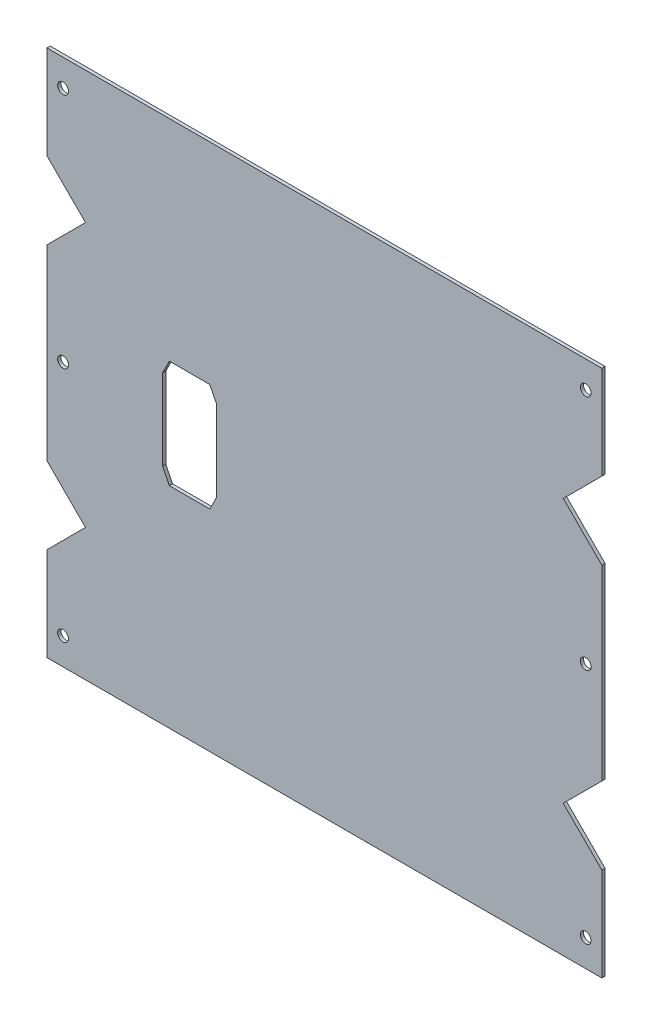
ISO-10303-21;
HEADER;
FILE_DESCRIPTION(('STEP AP214'),'2;1');
FILE_NAME('part.step','',(''),(''),'','','');
FILE_SCHEMA(('AUTOMOTIVE_DESIGN { 1 0 10303 214 1 1 1 1 }'));
ENDSEC;
DATA;
#1=APPLICATION_CONTEXT('core data for automotive mechanical design processes');
#2=APPLICATION_PROTOCOL_DEFINITION('international standard','automotive_design',2000,#1);
#3=PRODUCT_CONTEXT('',#1,'mechanical');
#4=PRODUCT('Part','Part','',(#3));
#5=PRODUCT_RELATED_PRODUCT_CATEGORY('part','',(#4));
#6=PRODUCT_DEFINITION_FORMATION('','',#4);
#7=PRODUCT_DEFINITION_CONTEXT('part definition',#1,'design');
#8=PRODUCT_DEFINITION('design','',#6,#7);
#9=PRODUCT_DEFINITION_SHAPE('','',#8);
#10=(LENGTH_UNIT() NAMED_UNIT(*) SI_UNIT(.MILLI.,.METRE.));
#11=(NAMED_UNIT(*) PLANE_ANGLE_UNIT() SI_UNIT($,.RADIAN.));
#12=(NAMED_UNIT(*) SI_UNIT($,.STERADIAN.) SOLID_ANGLE_UNIT());
#13=UNCERTAINTY_MEASURE_WITH_UNIT(LENGTH_MEASURE(1.E-05),#10,'distance_accuracy_value','');
#14=(GEOMETRIC_REPRESENTATION_CONTEXT(3) GLOBAL_UNCERTAINTY_ASSIGNED_CONTEXT((#13)) GLOBAL_UNIT_ASSIGNED_CONTEXT((#10,
#11,#12)) REPRESENTATION_CONTEXT('',''));
#15=CARTESIAN_POINT('',(0.,0.,0.));
#16=DIRECTION('',(0.,0.,1.));
#17=DIRECTION('',(1.,0.,0.));
#18=AXIS2_PLACEMENT_3D('',#15,#16,#17);
#19=CARTESIAN_POINT('',(0.,0.,-1.2));
#20=DIRECTION('',(0.,0.,1.));
#21=DIRECTION('',(1.,0.,0.));
#22=AXIS2_PLACEMENT_3D('',#19,#20,#21);
#23=PLANE('',#22);
#24=DIRECTION('',(0.707106781186546,0.707106781186549,0.));
#25=VECTOR('',#24,1.);
#26=CARTESIAN_POINT('',(-112.74800186836,24.8232233047034,-1.19999999999987));
#27=LINE('',#26,#25);
#28=CARTESIAN_POINT('',(-102.924778563656,34.6464466094067,-1.19999999999992));
#29=VERTEX_POINT('',#28);
#30=CARTESIAN_POINT('',(-88.6088358912349,48.9623892818282,-1.20000000000002));
#31=VERTEX_POINT('',#30);
#32=EDGE_CURVE('E860',#29,#31,#27,.T.);
#33=ORIENTED_EDGE('',*,*,#32,.T.);
#34=DIRECTION('',(-0.707106781186546,0.707106781186549,0.));
#35=VECTOR('',#34,1.);
#36=CARTESIAN_POINT('',(-112.748001868359,73.1015552589528,-1.19999999999967));
#37=LINE('',#36,#35);
#38=CARTESIAN_POINT('',(-102.924778563656,63.2783319542498,-1.19999999999982));
#39=VERTEX_POINT('',#38);
#40=EDGE_CURVE('E750',#31,#39,#37,.T.);
#41=ORIENTED_EDGE('',*,*,#40,.T.);
#42=DIRECTION('',(0.,1.,0.));
#43=VECTOR('',#42,1.);
#44=CARTESIAN_POINT('',(-102.924778563656,50.1247785636565,-1.19999999999991));
#45=LINE('',#44,#43);
#46=CARTESIAN_POINT('',(-102.924778563656,97.9247785636565,-1.19999999999958));
#47=VERTEX_POINT('',#46);
#48=EDGE_CURVE('E761',#47,#39,#45,.F.);
#49=ORIENTED_EDGE('',*,*,#48,.F.);
#50=DIRECTION('',(1.,0.,0.));
#51=VECTOR('',#50,1.);
#52=CARTESIAN_POINT('',(89.1247785636564,97.9247785636565,-1.19999999999968));
#53=LINE('',#52,#51);
#54=CARTESIAN_POINT('',(102.924778563656,97.9247785636565,-1.1999999999996));
#55=VERTEX_POINT('',#54);
#56=EDGE_CURVE('E779',#55,#47,#53,.F.);
#57=ORIENTED_EDGE('',*,*,#56,.F.);
#58=DIRECTION('',(0.,-1.,0.));
#59=VECTOR('',#58,1.);
#60=CARTESIAN_POINT('',(102.924778563656,97.9247785636565,-1.1999999999996));
#61=LINE('',#60,#59);
#62=CARTESIAN_POINT('',(102.924778563656,63.2783319542498,-1.19999999999984));
#63=VERTEX_POINT('',#62);
#64=EDGE_CURVE('E774',#63,#55,#61,.F.);
#65=ORIENTED_EDGE('',*,*,#64,.F.);
#66=DIRECTION('',(-0.707106781186546,-0.707106781186549,0.));
#67=VECTOR('',#66,1.);
#68=CARTESIAN_POINT('',(112.748001868359,73.1015552589529,-1.19999999999969));
#69=LINE('',#68,#67);
#70=CARTESIAN_POINT('',(88.6088358912349,48.9623892818282,-1.20000000000003));
#71=VERTEX_POINT('',#70);
#72=EDGE_CURVE('E753',#63,#71,#69,.T.);
#73=ORIENTED_EDGE('',*,*,#72,.T.);
#74=DIRECTION('',(0.707106781186546,-0.707106781186549,0.));
#75=VECTOR('',#74,1.);
#76=CARTESIAN_POINT('',(112.74800186836,24.8232233047034,-1.19999999999985));
#77=LINE('',#76,#75);
#78=CARTESIAN_POINT('',(102.924778563656,34.6464466094067,-1.19999999999991));
#79=VERTEX_POINT('',#78);
#80=EDGE_CURVE('E837',#71,#79,#77,.T.);
#81=ORIENTED_EDGE('',*,*,#80,.T.);
#82=DIRECTION('',(0.,-1.,0.));
#83=VECTOR('',#82,1.);
#84=CARTESIAN_POINT('',(102.924778563656,47.8,-1.19999999999991));
#85=LINE('',#84,#83);
#86=CARTESIAN_POINT('',(102.924778563656,-34.6464466094067,-1.19999999999991));
#87=VERTEX_POINT('',#86);
#88=EDGE_CURVE('E786',#87,#79,#85,.F.);
#89=ORIENTED_EDGE('',*,*,#88,.F.);
#90=DIRECTION('',(-0.707106781186546,-0.707106781186549,0.));
#91=VECTOR('',#90,1.);
#92=CARTESIAN_POINT('',(112.74800186836,-24.8232233047034,-1.19999999999985));
#93=LINE('',#92,#91);
#94=CARTESIAN_POINT('',(88.6088358912349,-48.9623892818283,-1.2));
#95=VERTEX_POINT('',#94);
#96=EDGE_CURVE('E835',#87,#95,#93,.T.);
#97=ORIENTED_EDGE('',*,*,#96,.T.);
#98=DIRECTION('',(0.707106781186546,-0.707106781186549,0.));
#99=VECTOR('',#98,1.);
#100=CARTESIAN_POINT('',(112.748001868359,-73.1015552589529,-1.19999999999966));
#101=LINE('',#100,#99);
#102=CARTESIAN_POINT('',(102.924778563656,-63.2783319542498,-1.19999999999981));
#103=VERTEX_POINT('',#102);
#104=EDGE_CURVE('E727',#95,#103,#101,.T.);
#105=ORIENTED_EDGE('',*,*,#104,.T.);
#106=DIRECTION('',(0.,-1.,0.));
#107=VECTOR('',#106,1.);
#108=CARTESIAN_POINT('',(102.924778563656,-50.1247785636565,-1.1999999999999));
#109=LINE('',#108,#107);
#110=CARTESIAN_POINT('',(102.924778563656,-97.9247785636565,-1.19999999999956));
#111=VERTEX_POINT('',#110);
#112=EDGE_CURVE('E799',#111,#103,#109,.F.);
#113=ORIENTED_EDGE('',*,*,#112,.F.);
#114=DIRECTION('',(-1.,0.,0.));
#115=VECTOR('',#114,1.);
#116=CARTESIAN_POINT('',(102.924778563656,-97.9247785636565,-1.19999999999956));
#117=LINE('',#116,#115);
#118=CARTESIAN_POINT('',(-102.924778563656,-97.9247785636565,-1.19999999999958));
#119=VERTEX_POINT('',#118);
#120=EDGE_CURVE('E818',#119,#111,#117,.F.);
#121=ORIENTED_EDGE('',*,*,#120,.F.);
#122=DIRECTION('',(0.,1.,0.));
#123=VECTOR('',#122,1.);
#124=CARTESIAN_POINT('',(-102.924778563656,-97.9247785636565,-1.19999999999958));
#125=LINE('',#124,#123);
#126=CARTESIAN_POINT('',(-102.924778563656,-63.2783319542498,-1.19999999999981));
#127=VERTEX_POINT('',#126);
#128=EDGE_CURVE('E812',#127,#119,#125,.F.);
#129=ORIENTED_EDGE('',*,*,#128,.F.);
#130=DIRECTION('',(0.707106781186546,0.707106781186549,0.));
#131=VECTOR('',#130,1.);
#132=CARTESIAN_POINT('',(-112.748001868359,-73.1015552589529,-1.19999999999966));
#133=LINE('',#132,#131);
#134=CARTESIAN_POINT('',(-88.6088358912349,-48.9623892818282,-1.19999999999999));
#135=VERTEX_POINT('',#134);
#136=EDGE_CURVE('E792',#127,#135,#133,.T.);
#137=ORIENTED_EDGE('',*,*,#136,.T.);
#138=DIRECTION('',(-0.707106781186546,0.707106781186549,0.));
#139=VECTOR('',#138,1.);
#140=CARTESIAN_POINT('',(-112.74800186836,-24.8232233047034,-1.19999999999987));
#141=LINE('',#140,#139);
#142=CARTESIAN_POINT('',(-102.924778563656,-34.6464466094067,-1.19999999999992));
#143=VERTEX_POINT('',#142);
#144=EDGE_CURVE('E862',#135,#143,#141,.T.);
#145=ORIENTED_EDGE('',*,*,#144,.T.);
#146=DIRECTION('',(0.,1.,0.));
#147=VECTOR('',#146,1.);
#148=CARTESIAN_POINT('',(-102.924778563656,-47.8,-1.19999999999992));
#149=LINE('',#148,#147);
#150=EDGE_CURVE('E711',#29,#143,#149,.F.);
#151=ORIENTED_EDGE('',*,*,#150,.F.);
#152=EDGE_LOOP('',(#33,#41,#49,#57,#65,#73,#81,#89,#97,#105,#113,#121,#129,#137,#145,#151));
#153=FACE_BOUND('',#152,.T.);
#154=DIRECTION('',(-1.,0.,0.));
#155=VECTOR('',#154,1.);
#156=CARTESIAN_POINT('',(0.,20.,-1.2));
#157=LINE('',#156,#155);
#158=CARTESIAN_POINT('',(-42.5,20.,-1.2));
#159=VERTEX_POINT('',#158);
#160=CARTESIAN_POINT('',(-57.5,20.,-1.2));
#161=VERTEX_POINT('',#160);
#162=EDGE_CURVE('E547',#159,#161,#157,.T.);
#163=ORIENTED_EDGE('',*,*,#162,.T.);
#164=DIRECTION('',(-0.447213595499958,-0.894427190999916,0.));
#165=VECTOR('',#164,1.);
#166=CARTESIAN_POINT('',(-54.,27.,-1.2));
#167=LINE('',#166,#165);
#168=CARTESIAN_POINT('',(-60.,15.,-1.2));
#169=VERTEX_POINT('',#168);
#170=EDGE_CURVE('E13',#161,#169,#167,.T.);
#171=ORIENTED_EDGE('',*,*,#170,.T.);
#172=DIRECTION('',(0.,-1.,0.));
#173=VECTOR('',#172,1.);
#174=CARTESIAN_POINT('',(-60.,0.,-1.2));
#175=LINE('',#174,#173);
#176=CARTESIAN_POINT('',(-60.,-15.,-1.2));
#177=VERTEX_POINT('',#176);
#178=EDGE_CURVE('E894',#169,#177,#175,.T.);
#179=ORIENTED_EDGE('',*,*,#178,.T.);
#180=DIRECTION('',(0.447213595499958,-0.894427190999916,0.));
#181=VECTOR('',#180,1.);
#182=CARTESIAN_POINT('',(-54.,-27.,-1.2));
#183=LINE('',#182,#181);
#184=CARTESIAN_POINT('',(-57.5,-20.,-1.2));
#185=VERTEX_POINT('',#184);
#186=EDGE_CURVE('E909',#177,#185,#183,.T.);
#187=ORIENTED_EDGE('',*,*,#186,.T.);
#188=DIRECTION('',(1.,0.,0.));
#189=VECTOR('',#188,1.);
#190=CARTESIAN_POINT('',(0.,-20.,-1.2));
#191=LINE('',#190,#189);
#192=CARTESIAN_POINT('',(-42.5,-20.,-1.2));
#193=VERTEX_POINT('',#192);
#194=EDGE_CURVE('E912',#185,#193,#191,.T.);
#195=ORIENTED_EDGE('',*,*,#194,.T.);
#196=DIRECTION('',(0.447213595499958,0.894427190999916,0.));
#197=VECTOR('',#196,1.);
#198=CARTESIAN_POINT('',(-26.,13.,-1.2));
#199=LINE('',#198,#197);
#200=CARTESIAN_POINT('',(-40.,-15.,-1.2));
#201=VERTEX_POINT('',#200);
#202=EDGE_CURVE('E915',#193,#201,#199,.T.);
#203=ORIENTED_EDGE('',*,*,#202,.T.);
#204=DIRECTION('',(0.,1.,0.));
#205=VECTOR('',#204,1.);
#206=CARTESIAN_POINT('',(-40.,0.,-1.2));
#207=LINE('',#206,#205);
#208=CARTESIAN_POINT('',(-40.,15.,-1.2));
#209=VERTEX_POINT('',#208);
#210=EDGE_CURVE('E918',#201,#209,#207,.T.);
#211=ORIENTED_EDGE('',*,*,#210,.T.);
#212=DIRECTION('',(-0.447213595499958,0.894427190999916,0.));
#213=VECTOR('',#212,1.);
#214=CARTESIAN_POINT('',(-26.,-13.,-1.2));
#215=LINE('',#214,#213);
#216=EDGE_CURVE('E921',#209,#159,#215,.T.);
#217=ORIENTED_EDGE('',*,*,#216,.T.);
#218=EDGE_LOOP('',(#163,#171,#179,#187,#195,#203,#211,#217));
#219=FACE_BOUND('',#218,.T.);
#220=CARTESIAN_POINT('',(-96.9247785636561,0.,-1.19999999999997));
#221=DIRECTION('',(0.,0.,-1.));
#222=DIRECTION('',(-1.,0.,0.));
#223=AXIS2_PLACEMENT_3D('',#220,#221,#222);
#224=CIRCLE('',#223,2.);
#225=CARTESIAN_POINT('',(-98.9247785636561,0.,-1.19999999999995));
#226=VERTEX_POINT('',#225);
#227=EDGE_CURVE('E865',#226,#226,#224,.T.);
#228=ORIENTED_EDGE('',*,*,#227,.F.);
#229=EDGE_LOOP('',(#228));
#230=FACE_BOUND('',#229,.T.);
#231=CARTESIAN_POINT('',(96.9247785636567,0.,-1.19999999999995));
#232=DIRECTION('',(0.,0.,-1.));
#233=DIRECTION('',(-1.,0.,0.));
#234=AXIS2_PLACEMENT_3D('',#231,#232,#233);
#235=CIRCLE('',#234,2.);
#236=CARTESIAN_POINT('',(94.9247785636567,0.,-1.19999999999996));
#237=VERTEX_POINT('',#236);
#238=EDGE_CURVE('E840',#237,#237,#235,.T.);
#239=ORIENTED_EDGE('',*,*,#238,.F.);
#240=EDGE_LOOP('',(#239));
#241=FACE_BOUND('',#240,.T.);
#242=CARTESIAN_POINT('',(-96.9247785636564,-87.9247785636565,-1.19999999999965));
#243=DIRECTION('',(0.,0.,-1.));
#244=DIRECTION('',(-1.,0.,0.));
#245=AXIS2_PLACEMENT_3D('',#242,#243,#244);
#246=CIRCLE('',#245,2.);
#247=CARTESIAN_POINT('',(-98.9247785636564,-87.9247785636564,-1.19999999999964));
#248=VERTEX_POINT('',#247);
#249=EDGE_CURVE('E820',#248,#248,#246,.T.);
#250=ORIENTED_EDGE('',*,*,#249,.F.);
#251=EDGE_LOOP('',(#250));
#252=FACE_BOUND('',#251,.T.);
#253=CARTESIAN_POINT('',(96.9247785636564,-87.924778563657,-1.19999999999967));
#254=DIRECTION('',(0.,0.,-1.));
#255=DIRECTION('',(-1.,0.,0.));
#256=AXIS2_PLACEMENT_3D('',#253,#254,#255);
#257=CIRCLE('',#256,2.);
#258=CARTESIAN_POINT('',(94.9247785636564,-87.924778563657,-1.19999999999968));
#259=VERTEX_POINT('',#258);
#260=EDGE_CURVE('E742',#259,#259,#257,.T.);
#261=ORIENTED_EDGE('',*,*,#260,.F.);
#262=EDGE_LOOP('',(#261));
#263=FACE_BOUND('',#262,.T.);
#264=CARTESIAN_POINT('',(-96.9247785636564,87.9247785636564,-1.19999999999971));
#265=DIRECTION('',(0.,0.,-1.));
#266=DIRECTION('',(1.,0.,0.));
#267=AXIS2_PLACEMENT_3D('',#264,#265,#266);
#268=CIRCLE('',#267,2.);
#269=CARTESIAN_POINT('',(-94.9247785636564,87.9247785636565,-1.19999999999972));
#270=VERTEX_POINT('',#269);
#271=EDGE_CURVE('E776',#270,#270,#268,.T.);
#272=ORIENTED_EDGE('',*,*,#271,.F.);
#273=EDGE_LOOP('',(#272));
#274=FACE_BOUND('',#273,.T.);
#275=CARTESIAN_POINT('',(96.9247785636564,87.924778563657,-1.1999999999997));
#276=DIRECTION('',(0.,0.,-1.));
#277=DIRECTION('',(1.,0.,0.));
#278=AXIS2_PLACEMENT_3D('',#275,#276,#277);
#279=CIRCLE('',#278,2.);
#280=CARTESIAN_POINT('',(98.9247785636564,87.924778563657,-1.19999999999969));
#281=VERTEX_POINT('',#280);
#282=EDGE_CURVE('E739',#281,#281,#279,.T.);
#283=ORIENTED_EDGE('',*,*,#282,.F.);
#284=EDGE_LOOP('',(#283));
#285=FACE_BOUND('',#284,.T.);
#286=ADVANCED_FACE('F539',(#153,#219,#230,#241,#252,#263,#274,#285),#23,.F.);
#287=CARTESIAN_POINT('',(0.,0.,0.));
#288=DIRECTION('',(0.,0.,1.));
#289=DIRECTION('',(1.,0.,0.));
#290=AXIS2_PLACEMENT_3D('',#287,#288,#289);
#291=PLANE('',#290);
#292=DIRECTION('',(-0.707106781186546,0.707106781186549,0.));
#293=VECTOR('',#292,1.);
#294=CARTESIAN_POINT('',(-90.1247785636564,50.4783319542497,0.));
#295=LINE('',#294,#293);
#296=CARTESIAN_POINT('',(-88.6088358912349,48.9623892818282,0.));
#297=VERTEX_POINT('',#296);
#298=CARTESIAN_POINT('',(-102.924778563656,63.2783319542498,1.87350135405495E-13));
#299=VERTEX_POINT('',#298);
#300=EDGE_CURVE('E743',#297,#299,#295,.T.);
#301=ORIENTED_EDGE('',*,*,#300,.F.);
#302=DIRECTION('',(0.707106781186546,0.707106781186549,0.));
#303=VECTOR('',#302,1.);
#304=CARTESIAN_POINT('',(-157.837189477156,-20.2659643040927,4.57966997657877E-13));
#305=LINE('',#304,#303);
#306=CARTESIAN_POINT('',(-102.924778563656,34.6464466094067,0.));
#307=VERTEX_POINT('',#306);
#308=EDGE_CURVE('E845',#307,#297,#305,.T.);
#309=ORIENTED_EDGE('',*,*,#308,.F.);
#310=DIRECTION('',(0.,-1.,0.));
#311=VECTOR('',#310,1.);
#312=CARTESIAN_POINT('',(-102.924778563656,0.,0.));
#313=LINE('',#312,#311);
#314=CARTESIAN_POINT('',(-102.924778563656,-34.6464466094067,0.));
#315=VERTEX_POINT('',#314);
#316=EDGE_CURVE('E850',#307,#315,#313,.T.);
#317=ORIENTED_EDGE('',*,*,#316,.T.);
#318=DIRECTION('',(-0.707106781186546,0.707106781186549,0.));
#319=VECTOR('',#318,1.);
#320=CARTESIAN_POINT('',(-90.1247785636564,-47.4464466094067,0.));
#321=LINE('',#320,#319);
#322=CARTESIAN_POINT('',(-88.6088358912349,-48.9623892818282,0.));
#323=VERTEX_POINT('',#322);
#324=EDGE_CURVE('E858',#323,#315,#321,.T.);
#325=ORIENTED_EDGE('',*,*,#324,.F.);
#326=DIRECTION('',(0.707106781186546,0.707106781186549,0.));
#327=VECTOR('',#326,1.);
#328=CARTESIAN_POINT('',(-124.884275797213,-85.2378291878067,4.71844785465692E-13));
#329=LINE('',#328,#327);
#330=CARTESIAN_POINT('',(-102.924778563656,-63.2783319542498,2.0122792321331E-13));
#331=VERTEX_POINT('',#330);
#332=EDGE_CURVE('E722',#331,#323,#329,.T.);
#333=ORIENTED_EDGE('',*,*,#332,.F.);
#334=DIRECTION('',(0.,-1.,0.));
#335=VECTOR('',#334,1.);
#336=CARTESIAN_POINT('',(-102.924778563656,-47.9247785636563,0.));
#337=LINE('',#336,#335);
#338=CARTESIAN_POINT('',(-102.924778563656,-97.9247785636565,4.30211422042248E-13));
#339=VERTEX_POINT('',#338);
#340=EDGE_CURVE('E807',#331,#339,#337,.T.);
#341=ORIENTED_EDGE('',*,*,#340,.T.);
#342=DIRECTION('',(1.,0.,0.));
#343=VECTOR('',#342,1.);
#344=CARTESIAN_POINT('',(-137.924778563656,-97.9247785636565,6.66133814775094E-13));
#345=LINE('',#344,#343);
#346=CARTESIAN_POINT('',(102.924778563656,-97.9247785636565,4.44089209850063E-13));
#347=VERTEX_POINT('',#346);
#348=EDGE_CURVE('E805',#339,#347,#345,.T.);
#349=ORIENTED_EDGE('',*,*,#348,.T.);
#350=DIRECTION('',(0.,1.,0.));
#351=VECTOR('',#350,1.);
#352=CARTESIAN_POINT('',(102.924778563656,-47.9247785636563,0.));
#353=LINE('',#352,#351);
#354=CARTESIAN_POINT('',(102.924778563656,-63.2783319542498,2.0122792321331E-13));
#355=VERTEX_POINT('',#354);
#356=EDGE_CURVE('E718',#347,#355,#353,.T.);
#357=ORIENTED_EDGE('',*,*,#356,.T.);
#358=DIRECTION('',(0.707106781186546,-0.707106781186549,0.));
#359=VECTOR('',#358,1.);
#360=CARTESIAN_POINT('',(90.1247785636564,-50.4783319542498,0.));
#361=LINE('',#360,#359);
#362=CARTESIAN_POINT('',(88.6088358912349,-48.9623892818283,0.));
#363=VERTEX_POINT('',#362);
#364=EDGE_CURVE('E714',#363,#355,#361,.T.);
#365=ORIENTED_EDGE('',*,*,#364,.F.);
#366=DIRECTION('',(-0.707106781186546,-0.707106781186549,0.));
#367=VECTOR('',#366,1.);
#368=CARTESIAN_POINT('',(157.837189477156,20.2659643040927,4.71844785465692E-13));
#369=LINE('',#368,#367);
#370=CARTESIAN_POINT('',(102.924778563656,-34.6464466094067,0.));
#371=VERTEX_POINT('',#370);
#372=EDGE_CURVE('E701',#371,#363,#369,.T.);
#373=ORIENTED_EDGE('',*,*,#372,.F.);
#374=DIRECTION('',(0.,1.,0.));
#375=VECTOR('',#374,1.);
#376=CARTESIAN_POINT('',(102.924778563656,0.,0.));
#377=LINE('',#376,#375);
#378=CARTESIAN_POINT('',(102.924778563656,34.6464466094067,0.));
#379=VERTEX_POINT('',#378);
#380=EDGE_CURVE('E826',#371,#379,#377,.T.);
#381=ORIENTED_EDGE('',*,*,#380,.T.);
#382=DIRECTION('',(0.707106781186546,-0.707106781186549,0.));
#383=VECTOR('',#382,1.);
#384=CARTESIAN_POINT('',(90.1247785636564,47.4464466094067,0.));
#385=LINE('',#384,#383);
#386=CARTESIAN_POINT('',(88.6088358912349,48.9623892818282,0.));
#387=VERTEX_POINT('',#386);
#388=EDGE_CURVE('E833',#387,#379,#385,.T.);
#389=ORIENTED_EDGE('',*,*,#388,.F.);
#390=DIRECTION('',(-0.707106781186546,-0.707106781186549,0.));
#391=VECTOR('',#390,1.);
#392=CARTESIAN_POINT('',(124.884275797213,85.2378291878067,4.37150315946155E-13));
#393=LINE('',#392,#391);
#394=CARTESIAN_POINT('',(102.924778563656,63.2783319542498,1.66533453693773E-13));
#395=VERTEX_POINT('',#394);
#396=EDGE_CURVE('E745',#395,#387,#393,.T.);
#397=ORIENTED_EDGE('',*,*,#396,.F.);
#398=DIRECTION('',(0.,1.,0.));
#399=VECTOR('',#398,1.);
#400=CARTESIAN_POINT('',(102.924778563656,47.9247785636563,0.));
#401=LINE('',#400,#399);
#402=CARTESIAN_POINT('',(102.924778563656,97.9247785636565,4.09394740330526E-13));
#403=VERTEX_POINT('',#402);
#404=EDGE_CURVE('E769',#395,#403,#401,.T.);
#405=ORIENTED_EDGE('',*,*,#404,.T.);
#406=DIRECTION('',(-1.,0.,0.));
#407=VECTOR('',#406,1.);
#408=CARTESIAN_POINT('',(137.924778563656,97.9247785636565,6.45317133063372E-13));
#409=LINE('',#408,#407);
#410=CARTESIAN_POINT('',(-102.924778563656,97.9247785636565,4.30211422042248E-13));
#411=VERTEX_POINT('',#410);
#412=EDGE_CURVE('E767',#403,#411,#409,.T.);
#413=ORIENTED_EDGE('',*,*,#412,.T.);
#414=DIRECTION('',(0.,-1.,0.));
#415=VECTOR('',#414,1.);
#416=CARTESIAN_POINT('',(-102.924778563656,47.9247785636563,0.));
#417=LINE('',#416,#415);
#418=EDGE_CURVE('E755',#411,#299,#417,.T.);
#419=ORIENTED_EDGE('',*,*,#418,.T.);
#420=EDGE_LOOP('',(#301,#309,#317,#325,#333,#341,#349,#357,#365,#373,#381,#389,#397,#405,#413,#419));
#421=FACE_BOUND('',#420,.T.);
#422=DIRECTION('',(-0.447213595499958,-0.894427190999916,0.));
#423=VECTOR('',#422,1.);
#424=CARTESIAN_POINT('',(-60.,15.,0.));
#425=LINE('',#424,#423);
#426=CARTESIAN_POINT('',(-57.5,20.,0.));
#427=VERTEX_POINT('',#426);
#428=CARTESIAN_POINT('',(-60.,15.,0.));
#429=VERTEX_POINT('',#428);
#430=EDGE_CURVE('E562',#427,#429,#425,.T.);
#431=ORIENTED_EDGE('',*,*,#430,.F.);
#432=DIRECTION('',(-1.,0.,0.));
#433=VECTOR('',#432,1.);
#434=CARTESIAN_POINT('',(-57.5,20.,0.));
#435=LINE('',#434,#433);
#436=CARTESIAN_POINT('',(-42.5,20.,0.));
#437=VERTEX_POINT('',#436);
#438=EDGE_CURVE('E888',#437,#427,#435,.T.);
#439=ORIENTED_EDGE('',*,*,#438,.F.);
#440=DIRECTION('',(-0.447213595499958,0.894427190999916,0.));
#441=VECTOR('',#440,1.);
#442=CARTESIAN_POINT('',(-42.5,20.,0.));
#443=LINE('',#442,#441);
#444=CARTESIAN_POINT('',(-40.,15.,0.));
#445=VERTEX_POINT('',#444);
#446=EDGE_CURVE('E885',#445,#437,#443,.T.);
#447=ORIENTED_EDGE('',*,*,#446,.F.);
#448=DIRECTION('',(0.,1.,0.));
#449=VECTOR('',#448,1.);
#450=CARTESIAN_POINT('',(-40.,15.,0.));
#451=LINE('',#450,#449);
#452=CARTESIAN_POINT('',(-40.,-15.,0.));
#453=VERTEX_POINT('',#452);
#454=EDGE_CURVE('E882',#453,#445,#451,.T.);
#455=ORIENTED_EDGE('',*,*,#454,.F.);
#456=DIRECTION('',(0.447213595499958,0.894427190999916,0.));
#457=VECTOR('',#456,1.);
#458=CARTESIAN_POINT('',(-42.5,-20.,0.));
#459=LINE('',#458,#457);
#460=CARTESIAN_POINT('',(-42.5,-20.,0.));
#461=VERTEX_POINT('',#460);
#462=EDGE_CURVE('E879',#461,#453,#459,.T.);
#463=ORIENTED_EDGE('',*,*,#462,.F.);
#464=DIRECTION('',(1.,0.,0.));
#465=VECTOR('',#464,1.);
#466=CARTESIAN_POINT('',(-57.5,-20.,0.));
#467=LINE('',#466,#465);
#468=CARTESIAN_POINT('',(-57.5,-20.,0.));
#469=VERTEX_POINT('',#468);
#470=EDGE_CURVE('E876',#469,#461,#467,.T.);
#471=ORIENTED_EDGE('',*,*,#470,.F.);
#472=DIRECTION('',(0.447213595499958,-0.894427190999916,0.));
#473=VECTOR('',#472,1.);
#474=CARTESIAN_POINT('',(-60.,-15.,0.));
#475=LINE('',#474,#473);
#476=CARTESIAN_POINT('',(-60.,-15.,0.));
#477=VERTEX_POINT('',#476);
#478=EDGE_CURVE('E873',#477,#469,#475,.T.);
#479=ORIENTED_EDGE('',*,*,#478,.F.);
#480=DIRECTION('',(0.,-1.,0.));
#481=VECTOR('',#480,1.);
#482=CARTESIAN_POINT('',(-60.,15.,0.));
#483=LINE('',#482,#481);
#484=EDGE_CURVE('E871',#429,#477,#483,.T.);
#485=ORIENTED_EDGE('',*,*,#484,.F.);
#486=EDGE_LOOP('',(#431,#439,#447,#455,#463,#471,#479,#485));
#487=FACE_BOUND('',#486,.T.);
#488=CARTESIAN_POINT('',(-96.9247785636561,0.,0.));
#489=DIRECTION('',(0.,0.,-1.));
#490=DIRECTION('',(-1.,0.,0.));
#491=AXIS2_PLACEMENT_3D('',#488,#489,#490);
#492=CIRCLE('',#491,2.);
#493=CARTESIAN_POINT('',(-98.9247785636561,0.,0.));
#494=VERTEX_POINT('',#493);
#495=EDGE_CURVE('E853',#494,#494,#492,.T.);
#496=ORIENTED_EDGE('',*,*,#495,.T.);
#497=EDGE_LOOP('',(#496));
#498=FACE_BOUND('',#497,.T.);
#499=CARTESIAN_POINT('',(96.9247785636567,0.,2.4980018054066E-13));
#500=DIRECTION('',(0.,0.,-1.));
#501=DIRECTION('',(-1.,0.,0.));
#502=AXIS2_PLACEMENT_3D('',#499,#500,#501);
#503=CIRCLE('',#502,2.);
#504=CARTESIAN_POINT('',(94.9247785636567,0.,2.4885103864898E-13));
#505=VERTEX_POINT('',#504);
#506=EDGE_CURVE('E828',#505,#505,#503,.T.);
#507=ORIENTED_EDGE('',*,*,#506,.T.);
#508=EDGE_LOOP('',(#507));
#509=FACE_BOUND('',#508,.T.);
#510=CARTESIAN_POINT('',(96.9247785636564,-87.924778563657,4.23272528138341E-13));
#511=DIRECTION('',(0.,0.,-1.));
#512=DIRECTION('',(0.,-1.,0.));
#513=AXIS2_PLACEMENT_3D('',#510,#511,#512);
#514=CIRCLE('',#513,2.);
#515=CARTESIAN_POINT('',(96.9247785636564,-89.924778563657,4.31160563933928E-13));
#516=VERTEX_POINT('',#515);
#517=EDGE_CURVE('E796',#516,#516,#514,.T.);
#518=ORIENTED_EDGE('',*,*,#517,.T.);
#519=EDGE_LOOP('',(#518));
#520=FACE_BOUND('',#519,.T.);
#521=CARTESIAN_POINT('',(-96.9247785636564,-87.9247785636565,3.53883589099269E-13));
#522=DIRECTION('',(0.,0.,-1.));
#523=DIRECTION('',(-1.,0.,0.));
#524=AXIS2_PLACEMENT_3D('',#521,#522,#523);
#525=CIRCLE('',#524,2.);
#526=CARTESIAN_POINT('',(-98.9247785636564,-87.9247785636564,3.66900372562961E-13));
#527=VERTEX_POINT('',#526);
#528=EDGE_CURVE('E809',#527,#527,#525,.T.);
#529=ORIENTED_EDGE('',*,*,#528,.T.);
#530=EDGE_LOOP('',(#529));
#531=FACE_BOUND('',#530,.T.);
#532=CARTESIAN_POINT('',(-96.9247785636564,87.9247785636564,3.2612801348364E-13));
#533=DIRECTION('',(0.,0.,-1.));
#534=DIRECTION('',(1.,0.,0.));
#535=AXIS2_PLACEMENT_3D('',#532,#533,#534);
#536=CIRCLE('',#535,2.);
#537=CARTESIAN_POINT('',(-94.9247785636564,87.9247785636565,3.11099956424612E-13));
#538=VERTEX_POINT('',#537);
#539=EDGE_CURVE('E758',#538,#538,#536,.T.);
#540=ORIENTED_EDGE('',*,*,#539,.T.);
#541=EDGE_LOOP('',(#540));
#542=FACE_BOUND('',#541,.T.);
#543=CARTESIAN_POINT('',(96.9247785636564,87.924778563657,3.88578058618805E-13));
#544=DIRECTION('',(0.,0.,-1.));
#545=DIRECTION('',(0.,-1.,0.));
#546=AXIS2_PLACEMENT_3D('',#543,#544,#545);
#547=CIRCLE('',#546,2.);
#548=CARTESIAN_POINT('',(96.9247785636564,85.924778563657,3.80690022823218E-13));
#549=VERTEX_POINT('',#548);
#550=EDGE_CURVE('E771',#549,#549,#547,.T.);
#551=ORIENTED_EDGE('',*,*,#550,.T.);
#552=EDGE_LOOP('',(#551));
#553=FACE_BOUND('',#552,.T.);
#554=ADVANCED_FACE('F541',(#421,#487,#498,#509,#520,#531,#542,#553),#291,.T.);
#555=CARTESIAN_POINT('',(-60.,15.,-10.));
#556=DIRECTION('',(-0.894427190999916,0.447213595499958,0.));
#557=DIRECTION('',(-0.447213595499958,-0.894427190999916,0.));
#558=AXIS2_PLACEMENT_3D('',#555,#556,#557);
#559=PLANE('',#558);
#560=DIRECTION('',(0.,0.,1.));
#561=VECTOR('',#560,1.);
#562=CARTESIAN_POINT('',(-57.5,20.,-10.));
#563=LINE('',#562,#561);
#564=EDGE_CURVE('E892',#161,#427,#563,.T.);
#565=ORIENTED_EDGE('',*,*,#564,.T.);
#566=ORIENTED_EDGE('',*,*,#430,.T.);
#567=DIRECTION('',(0.,0.,1.));
#568=VECTOR('',#567,1.);
#569=CARTESIAN_POINT('',(-60.,15.,-10.));
#570=LINE('',#569,#568);
#571=EDGE_CURVE('E891',#169,#429,#570,.T.);
#572=ORIENTED_EDGE('',*,*,#571,.F.);
#573=ORIENTED_EDGE('',*,*,#170,.F.);
#574=EDGE_LOOP('',(#565,#566,#572,#573));
#575=FACE_BOUND('',#574,.T.);
#576=ADVANCED_FACE('F941',(#575),#559,.F.);
#577=CARTESIAN_POINT('',(-57.5,20.,-10.));
#578=DIRECTION('',(0.,1.,0.));
#579=DIRECTION('',(0.,0.,1.));
#580=AXIS2_PLACEMENT_3D('',#577,#578,#579);
#581=PLANE('',#580);
#582=DIRECTION('',(0.,0.,1.));
#583=VECTOR('',#582,1.);
#584=CARTESIAN_POINT('',(-42.5,20.,-10.));
#585=LINE('',#584,#583);
#586=EDGE_CURVE('E895',#159,#437,#585,.T.);
#587=ORIENTED_EDGE('',*,*,#586,.T.);
#588=ORIENTED_EDGE('',*,*,#438,.T.);
#589=ORIENTED_EDGE('',*,*,#564,.F.);
#590=ORIENTED_EDGE('',*,*,#162,.F.);
#591=EDGE_LOOP('',(#587,#588,#589,#590));
#592=FACE_BOUND('',#591,.T.);
#593=ADVANCED_FACE('F929',(#592),#581,.F.);
#594=CARTESIAN_POINT('',(-42.5,20.,-10.));
#595=DIRECTION('',(0.894427190999916,0.447213595499958,0.));
#596=DIRECTION('',(-0.447213595499958,0.894427190999916,0.));
#597=AXIS2_PLACEMENT_3D('',#594,#595,#596);
#598=PLANE('',#597);
#599=DIRECTION('',(0.,0.,1.));
#600=VECTOR('',#599,1.);
#601=CARTESIAN_POINT('',(-40.,15.,-10.));
#602=LINE('',#601,#600);
#603=EDGE_CURVE('E897',#209,#445,#602,.T.);
#604=ORIENTED_EDGE('',*,*,#603,.T.);
#605=ORIENTED_EDGE('',*,*,#446,.T.);
#606=ORIENTED_EDGE('',*,*,#586,.F.);
#607=ORIENTED_EDGE('',*,*,#216,.F.);
#608=EDGE_LOOP('',(#604,#605,#606,#607));
#609=FACE_BOUND('',#608,.T.);
#610=ADVANCED_FACE('F931',(#609),#598,.F.);
#611=CARTESIAN_POINT('',(-40.,15.,-10.));
#612=DIRECTION('',(1.,0.,0.));
#613=DIRECTION('',(0.,1.,0.));
#614=AXIS2_PLACEMENT_3D('',#611,#612,#613);
#615=PLANE('',#614);
#616=DIRECTION('',(0.,0.,1.));
#617=VECTOR('',#616,1.);
#618=CARTESIAN_POINT('',(-40.,-15.,-10.));
#619=LINE('',#618,#617);
#620=EDGE_CURVE('E899',#201,#453,#619,.T.);
#621=ORIENTED_EDGE('',*,*,#620,.T.);
#622=ORIENTED_EDGE('',*,*,#454,.T.);
#623=ORIENTED_EDGE('',*,*,#603,.F.);
#624=ORIENTED_EDGE('',*,*,#210,.F.);
#625=EDGE_LOOP('',(#621,#622,#623,#624));
#626=FACE_BOUND('',#625,.T.);
#627=ADVANCED_FACE('F1032',(#626),#615,.F.);
#628=CARTESIAN_POINT('',(-42.5,-20.,-10.));
#629=DIRECTION('',(0.894427190999916,-0.447213595499958,0.));
#630=DIRECTION('',(0.447213595499958,0.894427190999916,0.));
#631=AXIS2_PLACEMENT_3D('',#628,#629,#630);
#632=PLANE('',#631);
#633=DIRECTION('',(0.,0.,1.));
#634=VECTOR('',#633,1.);
#635=CARTESIAN_POINT('',(-42.5,-20.,-10.));
#636=LINE('',#635,#634);
#637=EDGE_CURVE('E901',#193,#461,#636,.T.);
#638=ORIENTED_EDGE('',*,*,#637,.T.);
#639=ORIENTED_EDGE('',*,*,#462,.T.);
#640=ORIENTED_EDGE('',*,*,#620,.F.);
#641=ORIENTED_EDGE('',*,*,#202,.F.);
#642=EDGE_LOOP('',(#638,#639,#640,#641));
#643=FACE_BOUND('',#642,.T.);
#644=ADVANCED_FACE('F1035',(#643),#632,.F.);
#645=CARTESIAN_POINT('',(-57.5,-20.,-10.));
#646=DIRECTION('',(0.,-1.,0.));
#647=DIRECTION('',(0.,0.,-1.));
#648=AXIS2_PLACEMENT_3D('',#645,#646,#647);
#649=PLANE('',#648);
#650=DIRECTION('',(0.,0.,1.));
#651=VECTOR('',#650,1.);
#652=CARTESIAN_POINT('',(-57.5,-20.,-10.));
#653=LINE('',#652,#651);
#654=EDGE_CURVE('E903',#185,#469,#653,.T.);
#655=ORIENTED_EDGE('',*,*,#654,.T.);
#656=ORIENTED_EDGE('',*,*,#470,.T.);
#657=ORIENTED_EDGE('',*,*,#637,.F.);
#658=ORIENTED_EDGE('',*,*,#194,.F.);
#659=EDGE_LOOP('',(#655,#656,#657,#658));
#660=FACE_BOUND('',#659,.T.);
#661=ADVANCED_FACE('F1039',(#660),#649,.F.);
#662=CARTESIAN_POINT('',(-60.,-15.,-10.));
#663=DIRECTION('',(-0.894427190999916,-0.447213595499958,0.));
#664=DIRECTION('',(0.447213595499958,-0.894427190999916,0.));
#665=AXIS2_PLACEMENT_3D('',#662,#663,#664);
#666=PLANE('',#665);
#667=DIRECTION('',(0.,0.,1.));
#668=VECTOR('',#667,1.);
#669=CARTESIAN_POINT('',(-60.,-15.,-10.));
#670=LINE('',#669,#668);
#671=EDGE_CURVE('E554',#177,#477,#670,.T.);
#672=ORIENTED_EDGE('',*,*,#671,.T.);
#673=ORIENTED_EDGE('',*,*,#478,.T.);
#674=ORIENTED_EDGE('',*,*,#654,.F.);
#675=ORIENTED_EDGE('',*,*,#186,.F.);
#676=EDGE_LOOP('',(#672,#673,#674,#675));
#677=FACE_BOUND('',#676,.T.);
#678=ADVANCED_FACE('F1022',(#677),#666,.F.);
#679=CARTESIAN_POINT('',(-60.,15.,-10.));
#680=DIRECTION('',(-1.,0.,0.));
#681=DIRECTION('',(0.,-1.,0.));
#682=AXIS2_PLACEMENT_3D('',#679,#680,#681);
#683=PLANE('',#682);
#684=ORIENTED_EDGE('',*,*,#571,.T.);
#685=ORIENTED_EDGE('',*,*,#484,.T.);
#686=ORIENTED_EDGE('',*,*,#671,.F.);
#687=ORIENTED_EDGE('',*,*,#178,.F.);
#688=EDGE_LOOP('',(#684,#685,#686,#687));
#689=FACE_BOUND('',#688,.T.);
#690=ADVANCED_FACE('F940',(#689),#683,.F.);
#691=CARTESIAN_POINT('',(-102.924778563656,-47.8,0.));
#692=DIRECTION('',(1.,0.,0.));
#693=DIRECTION('',(0.,0.,-1.));
#694=AXIS2_PLACEMENT_3D('',#691,#692,#693);
#695=PLANE('',#694);
#696=DIRECTION('',(0.,0.,-1.));
#697=VECTOR('',#696,1.);
#698=CARTESIAN_POINT('',(-102.924778563656,-34.6464466094067,0.));
#699=LINE('',#698,#697);
#700=EDGE_CURVE('E856',#315,#143,#699,.T.);
#701=ORIENTED_EDGE('',*,*,#700,.F.);
#702=ORIENTED_EDGE('',*,*,#316,.F.);
#703=DIRECTION('',(0.,0.,1.));
#704=VECTOR('',#703,1.);
#705=CARTESIAN_POINT('',(-102.924778563656,34.6464466094067,0.));
#706=LINE('',#705,#704);
#707=EDGE_CURVE('E847',#29,#307,#706,.T.);
#708=ORIENTED_EDGE('',*,*,#707,.F.);
#709=ORIENTED_EDGE('',*,*,#150,.T.);
#710=EDGE_LOOP('',(#701,#702,#708,#709));
#711=FACE_BOUND('',#710,.T.);
#712=ADVANCED_FACE('F1012',(#711),#695,.F.);
#713=CARTESIAN_POINT('',(-96.9247785636573,0.,-180.));
#714=DIRECTION('',(0.,0.,1.));
#715=DIRECTION('',(1.,0.,0.));
#716=AXIS2_PLACEMENT_3D('',#713,#714,#715);
#717=CYLINDRICAL_SURFACE('',#716,2.);
#718=ORIENTED_EDGE('',*,*,#227,.T.);
#719=EDGE_LOOP('',(#718));
#720=FACE_BOUND('',#719,.T.);
#721=ORIENTED_EDGE('',*,*,#495,.F.);
#722=EDGE_LOOP('',(#721));
#723=FACE_BOUND('',#722,.T.);
#724=ADVANCED_FACE('F1014',(#720,#723),#717,.F.);
#725=CARTESIAN_POINT('',(-90.1247785636564,-47.4464466094067,0.));
#726=DIRECTION('',(-0.707106781186549,-0.707106781186546,0.));
#727=DIRECTION('',(-0.707106781186546,0.707106781186549,0.));
#728=AXIS2_PLACEMENT_3D('',#725,#726,#727);
#729=PLANE('',#728);
#730=ORIENTED_EDGE('',*,*,#144,.F.);
#731=DIRECTION('',(0.,0.,-1.));
#732=VECTOR('',#731,1.);
#733=CARTESIAN_POINT('',(-88.6088358912349,-48.9623892818282,0.));
#734=LINE('',#733,#732);
#735=EDGE_CURVE('E731',#323,#135,#734,.T.);
#736=ORIENTED_EDGE('',*,*,#735,.F.);
#737=ORIENTED_EDGE('',*,*,#324,.T.);
#738=ORIENTED_EDGE('',*,*,#700,.T.);
#739=EDGE_LOOP('',(#730,#736,#737,#738));
#740=FACE_BOUND('',#739,.T.);
#741=ADVANCED_FACE('F1009',(#740),#729,.T.);
#742=CARTESIAN_POINT('',(-157.837189477156,-20.2659643040927,4.57966997657877E-13));
#743=DIRECTION('',(-0.707106781186549,0.707106781186546,0.));
#744=DIRECTION('',(0.707106781186546,0.707106781186549,0.));
#745=AXIS2_PLACEMENT_3D('',#742,#743,#744);
#746=PLANE('',#745);
#747=ORIENTED_EDGE('',*,*,#32,.F.);
#748=ORIENTED_EDGE('',*,*,#707,.T.);
#749=ORIENTED_EDGE('',*,*,#308,.T.);
#750=DIRECTION('',(0.,0.,-1.));
#751=VECTOR('',#750,1.);
#752=CARTESIAN_POINT('',(-88.6088358912349,48.9623892818282,0.));
#753=LINE('',#752,#751);
#754=EDGE_CURVE('E728',#297,#31,#753,.T.);
#755=ORIENTED_EDGE('',*,*,#754,.T.);
#756=EDGE_LOOP('',(#747,#748,#749,#755));
#757=FACE_BOUND('',#756,.T.);
#758=ADVANCED_FACE('F963',(#757),#746,.T.);
#759=CARTESIAN_POINT('',(102.924778563656,47.8,1.11022302462516E-13));
#760=DIRECTION('',(-1.,0.,0.));
#761=DIRECTION('',(0.,0.,1.));
#762=AXIS2_PLACEMENT_3D('',#759,#760,#761);
#763=PLANE('',#762);
#764=DIRECTION('',(0.,0.,-1.));
#765=VECTOR('',#764,1.);
#766=CARTESIAN_POINT('',(102.924778563656,34.6464466094067,1.11022302462516E-13));
#767=LINE('',#766,#765);
#768=EDGE_CURVE('E831',#379,#79,#767,.T.);
#769=ORIENTED_EDGE('',*,*,#768,.F.);
#770=ORIENTED_EDGE('',*,*,#380,.F.);
#771=DIRECTION('',(0.,0.,1.));
#772=VECTOR('',#771,1.);
#773=CARTESIAN_POINT('',(102.924778563656,-34.6464466094067,0.));
#774=LINE('',#773,#772);
#775=EDGE_CURVE('E707',#87,#371,#774,.T.);
#776=ORIENTED_EDGE('',*,*,#775,.F.);
#777=ORIENTED_EDGE('',*,*,#88,.T.);
#778=EDGE_LOOP('',(#769,#770,#776,#777));
#779=FACE_BOUND('',#778,.T.);
#780=ADVANCED_FACE('F989',(#779),#763,.F.);
#781=CARTESIAN_POINT('',(96.9247785636567,0.,2.4980018054066E-13));
#782=DIRECTION('',(0.,0.,-1.));
#783=DIRECTION('',(-1.,0.,0.));
#784=AXIS2_PLACEMENT_3D('',#781,#782,#783);
#785=CYLINDRICAL_SURFACE('',#784,2.);
#786=ORIENTED_EDGE('',*,*,#238,.T.);
#787=EDGE_LOOP('',(#786));
#788=FACE_BOUND('',#787,.T.);
#789=ORIENTED_EDGE('',*,*,#506,.F.);
#790=EDGE_LOOP('',(#789));
#791=FACE_BOUND('',#790,.T.);
#792=ADVANCED_FACE('F1096',(#788,#791),#785,.F.);
#793=CARTESIAN_POINT('',(90.1247785636564,47.4464466094067,0.));
#794=DIRECTION('',(0.707106781186549,0.707106781186546,0.));
#795=DIRECTION('',(-0.707106781186546,0.707106781186549,0.));
#796=AXIS2_PLACEMENT_3D('',#793,#794,#795);
#797=PLANE('',#796);
#798=ORIENTED_EDGE('',*,*,#80,.F.);
#799=DIRECTION('',(0.,0.,-1.));
#800=VECTOR('',#799,1.);
#801=CARTESIAN_POINT('',(88.6088358912349,48.9623892818282,0.));
#802=LINE('',#801,#800);
#803=EDGE_CURVE('E736',#387,#71,#802,.T.);
#804=ORIENTED_EDGE('',*,*,#803,.F.);
#805=ORIENTED_EDGE('',*,*,#388,.T.);
#806=ORIENTED_EDGE('',*,*,#768,.T.);
#807=EDGE_LOOP('',(#798,#804,#805,#806));
#808=FACE_BOUND('',#807,.T.);
#809=ADVANCED_FACE('F986',(#808),#797,.T.);
#810=CARTESIAN_POINT('',(157.837189477156,20.2659643040927,4.71844785465692E-13));
#811=DIRECTION('',(0.707106781186549,-0.707106781186546,0.));
#812=DIRECTION('',(0.707106781186546,0.707106781186549,0.));
#813=AXIS2_PLACEMENT_3D('',#810,#811,#812);
#814=PLANE('',#813);
#815=ORIENTED_EDGE('',*,*,#96,.F.);
#816=ORIENTED_EDGE('',*,*,#775,.T.);
#817=ORIENTED_EDGE('',*,*,#372,.T.);
#818=DIRECTION('',(0.,0.,-1.));
#819=VECTOR('',#818,1.);
#820=CARTESIAN_POINT('',(88.6088358912349,-48.9623892818283,0.));
#821=LINE('',#820,#819);
#822=EDGE_CURVE('E706',#363,#95,#821,.T.);
#823=ORIENTED_EDGE('',*,*,#822,.T.);
#824=EDGE_LOOP('',(#815,#816,#817,#823));
#825=FACE_BOUND('',#824,.T.);
#826=ADVANCED_FACE('F704',(#825),#814,.T.);
#827=CARTESIAN_POINT('',(96.9247785636564,-87.924778563657,4.23272528138341E-13));
#828=DIRECTION('',(0.,0.,-1.));
#829=DIRECTION('',(0.,1.,0.));
#830=AXIS2_PLACEMENT_3D('',#827,#828,#829);
#831=CYLINDRICAL_SURFACE('',#830,2.);
#832=ORIENTED_EDGE('',*,*,#260,.T.);
#833=EDGE_LOOP('',(#832));
#834=FACE_BOUND('',#833,.T.);
#835=ORIENTED_EDGE('',*,*,#517,.F.);
#836=EDGE_LOOP('',(#835));
#837=FACE_BOUND('',#836,.T.);
#838=ADVANCED_FACE('F1124',(#834,#837),#831,.F.);
#839=CARTESIAN_POINT('',(-96.924778563657,-87.9247785636582,-180.));
#840=DIRECTION('',(0.,0.,1.));
#841=DIRECTION('',(0.,1.,0.));
#842=AXIS2_PLACEMENT_3D('',#839,#840,#841);
#843=CYLINDRICAL_SURFACE('',#842,2.);
#844=ORIENTED_EDGE('',*,*,#249,.T.);
#845=EDGE_LOOP('',(#844));
#846=FACE_BOUND('',#845,.T.);
#847=ORIENTED_EDGE('',*,*,#528,.F.);
#848=EDGE_LOOP('',(#847));
#849=FACE_BOUND('',#848,.T.);
#850=ADVANCED_FACE('F1133',(#846,#849),#843,.F.);
#851=CARTESIAN_POINT('',(102.924778563656,-97.9247785636565,4.44089209850063E-13));
#852=DIRECTION('',(0.,1.,0.));
#853=DIRECTION('',(-1.,0.,0.));
#854=AXIS2_PLACEMENT_3D('',#851,#852,#853);
#855=PLANE('',#854);
#856=DIRECTION('',(0.,0.,-1.));
#857=VECTOR('',#856,1.);
#858=CARTESIAN_POINT('',(102.924778563656,-97.9247785636565,4.44089209850063E-13));
#859=LINE('',#858,#857);
#860=EDGE_CURVE('E802',#347,#111,#859,.T.);
#861=ORIENTED_EDGE('',*,*,#860,.F.);
#862=ORIENTED_EDGE('',*,*,#348,.F.);
#863=DIRECTION('',(0.,0.,-1.));
#864=VECTOR('',#863,1.);
#865=CARTESIAN_POINT('',(-102.924778563656,-97.9247785636565,4.30211422042248E-13));
#866=LINE('',#865,#864);
#867=EDGE_CURVE('E815',#339,#119,#866,.T.);
#868=ORIENTED_EDGE('',*,*,#867,.T.);
#869=ORIENTED_EDGE('',*,*,#120,.T.);
#870=EDGE_LOOP('',(#861,#862,#868,#869));
#871=FACE_BOUND('',#870,.T.);
#872=ADVANCED_FACE('F996',(#871),#855,.F.);
#873=CARTESIAN_POINT('',(-102.924778563656,-97.9247785636565,4.30211422042248E-13));
#874=DIRECTION('',(1.,0.,0.));
#875=DIRECTION('',(0.,0.,-1.));
#876=AXIS2_PLACEMENT_3D('',#873,#874,#875);
#877=PLANE('',#876);
#878=DIRECTION('',(0.,0.,1.));
#879=VECTOR('',#878,1.);
#880=CARTESIAN_POINT('',(-102.924778563656,-63.2783319542498,1.87350135405495E-13));
#881=LINE('',#880,#879);
#882=EDGE_CURVE('E789',#127,#331,#881,.T.);
#883=ORIENTED_EDGE('',*,*,#882,.F.);
#884=ORIENTED_EDGE('',*,*,#128,.T.);
#885=ORIENTED_EDGE('',*,*,#867,.F.);
#886=ORIENTED_EDGE('',*,*,#340,.F.);
#887=EDGE_LOOP('',(#883,#884,#885,#886));
#888=FACE_BOUND('',#887,.T.);
#889=ADVANCED_FACE('F1001',(#888),#877,.F.);
#890=CARTESIAN_POINT('',(102.924778563656,-50.1247785636565,1.11022302462516E-13));
#891=DIRECTION('',(-1.,0.,0.));
#892=DIRECTION('',(0.,0.,1.));
#893=AXIS2_PLACEMENT_3D('',#890,#891,#892);
#894=PLANE('',#893);
#895=DIRECTION('',(0.,0.,-1.));
#896=VECTOR('',#895,1.);
#897=CARTESIAN_POINT('',(102.924778563656,-63.2783319542498,2.0122792321331E-13));
#898=LINE('',#897,#896);
#899=EDGE_CURVE('E721',#355,#103,#898,.T.);
#900=ORIENTED_EDGE('',*,*,#899,.F.);
#901=ORIENTED_EDGE('',*,*,#356,.F.);
#902=ORIENTED_EDGE('',*,*,#860,.T.);
#903=ORIENTED_EDGE('',*,*,#112,.T.);
#904=EDGE_LOOP('',(#900,#901,#902,#903));
#905=FACE_BOUND('',#904,.T.);
#906=ADVANCED_FACE('F992',(#905),#894,.F.);
#907=CARTESIAN_POINT('',(-124.884275797213,-85.2378291878067,4.71844785465692E-13));
#908=DIRECTION('',(-0.707106781186549,0.707106781186546,0.));
#909=DIRECTION('',(0.707106781186546,0.707106781186549,0.));
#910=AXIS2_PLACEMENT_3D('',#907,#908,#909);
#911=PLANE('',#910);
#912=ORIENTED_EDGE('',*,*,#136,.F.);
#913=ORIENTED_EDGE('',*,*,#882,.T.);
#914=ORIENTED_EDGE('',*,*,#332,.T.);
#915=ORIENTED_EDGE('',*,*,#735,.T.);
#916=EDGE_LOOP('',(#912,#913,#914,#915));
#917=FACE_BOUND('',#916,.T.);
#918=ADVANCED_FACE('F1004',(#917),#911,.T.);
#919=CARTESIAN_POINT('',(90.1247785636564,-50.4783319542498,0.));
#920=DIRECTION('',(0.707106781186549,0.707106781186546,0.));
#921=DIRECTION('',(-0.707106781186546,0.707106781186549,0.));
#922=AXIS2_PLACEMENT_3D('',#919,#920,#921);
#923=PLANE('',#922);
#924=ORIENTED_EDGE('',*,*,#104,.F.);
#925=ORIENTED_EDGE('',*,*,#822,.F.);
#926=ORIENTED_EDGE('',*,*,#364,.T.);
#927=ORIENTED_EDGE('',*,*,#899,.T.);
#928=EDGE_LOOP('',(#924,#925,#926,#927));
#929=FACE_BOUND('',#928,.T.);
#930=ADVANCED_FACE('F725',(#929),#923,.T.);
#931=CARTESIAN_POINT('',(96.9247785636564,87.924778563657,3.88578058618805E-13));
#932=DIRECTION('',(0.,0.,-1.));
#933=DIRECTION('',(0.,-1.,0.));
#934=AXIS2_PLACEMENT_3D('',#931,#932,#933);
#935=CYLINDRICAL_SURFACE('',#934,2.);
#936=ORIENTED_EDGE('',*,*,#282,.T.);
#937=EDGE_LOOP('',(#936));
#938=FACE_BOUND('',#937,.T.);
#939=ORIENTED_EDGE('',*,*,#550,.F.);
#940=EDGE_LOOP('',(#939));
#941=FACE_BOUND('',#940,.T.);
#942=ADVANCED_FACE('F1194',(#938,#941),#935,.F.);
#943=CARTESIAN_POINT('',(89.1247785636564,97.9247785636565,3.2612801348364E-13));
#944=DIRECTION('',(0.,-1.,0.));
#945=DIRECTION('',(1.,0.,0.));
#946=AXIS2_PLACEMENT_3D('',#943,#944,#945);
#947=PLANE('',#946);
#948=ORIENTED_EDGE('',*,*,#56,.T.);
#949=DIRECTION('',(0.,0.,-1.));
#950=VECTOR('',#949,1.);
#951=CARTESIAN_POINT('',(-102.924778563656,97.9247785636565,4.30211422042248E-13));
#952=LINE('',#951,#950);
#953=EDGE_CURVE('E764',#411,#47,#952,.T.);
#954=ORIENTED_EDGE('',*,*,#953,.F.);
#955=ORIENTED_EDGE('',*,*,#412,.F.);
#956=DIRECTION('',(0.,0.,-1.));
#957=VECTOR('',#956,1.);
#958=CARTESIAN_POINT('',(102.924778563656,97.9247785636565,4.09394740330526E-13));
#959=LINE('',#958,#957);
#960=EDGE_CURVE('E781',#403,#55,#959,.T.);
#961=ORIENTED_EDGE('',*,*,#960,.T.);
#962=EDGE_LOOP('',(#948,#954,#955,#961));
#963=FACE_BOUND('',#962,.T.);
#964=ADVANCED_FACE('F973',(#963),#947,.F.);
#965=CARTESIAN_POINT('',(-96.924778563657,87.9247785636582,-180.));
#966=DIRECTION('',(0.,0.,1.));
#967=DIRECTION('',(0.,-1.,0.));
#968=AXIS2_PLACEMENT_3D('',#965,#966,#967);
#969=CYLINDRICAL_SURFACE('',#968,2.);
#970=ORIENTED_EDGE('',*,*,#271,.T.);
#971=EDGE_LOOP('',(#970));
#972=FACE_BOUND('',#971,.T.);
#973=ORIENTED_EDGE('',*,*,#539,.F.);
#974=EDGE_LOOP('',(#973));
#975=FACE_BOUND('',#974,.T.);
#976=ADVANCED_FACE('F1215',(#972,#975),#969,.F.);
#977=CARTESIAN_POINT('',(102.924778563656,97.9247785636565,4.09394740330526E-13));
#978=DIRECTION('',(-1.,0.,0.));
#979=DIRECTION('',(0.,0.,-1.));
#980=AXIS2_PLACEMENT_3D('',#977,#978,#979);
#981=PLANE('',#980);
#982=DIRECTION('',(0.,0.,1.));
#983=VECTOR('',#982,1.);
#984=CARTESIAN_POINT('',(102.924778563656,63.2783319542498,1.52655665885959E-13));
#985=LINE('',#984,#983);
#986=EDGE_CURVE('E747',#63,#395,#985,.T.);
#987=ORIENTED_EDGE('',*,*,#986,.F.);
#988=ORIENTED_EDGE('',*,*,#64,.T.);
#989=ORIENTED_EDGE('',*,*,#960,.F.);
#990=ORIENTED_EDGE('',*,*,#404,.F.);
#991=EDGE_LOOP('',(#987,#988,#989,#990));
#992=FACE_BOUND('',#991,.T.);
#993=ADVANCED_FACE('F978',(#992),#981,.F.);
#994=CARTESIAN_POINT('',(-102.924778563656,50.1247785636564,0.));
#995=DIRECTION('',(1.,0.,0.));
#996=DIRECTION('',(0.,0.,1.));
#997=AXIS2_PLACEMENT_3D('',#994,#995,#996);
#998=PLANE('',#997);
#999=DIRECTION('',(0.,0.,-1.));
#1000=VECTOR('',#999,1.);
#1001=CARTESIAN_POINT('',(-102.924778563656,63.2783319542498,1.87350135405495E-13));
#1002=LINE('',#1001,#1000);
#1003=EDGE_CURVE('E740',#299,#39,#1002,.T.);
#1004=ORIENTED_EDGE('',*,*,#1003,.F.);
#1005=ORIENTED_EDGE('',*,*,#418,.F.);
#1006=ORIENTED_EDGE('',*,*,#953,.T.);
#1007=ORIENTED_EDGE('',*,*,#48,.T.);
#1008=EDGE_LOOP('',(#1004,#1005,#1006,#1007));
#1009=FACE_BOUND('',#1008,.T.);
#1010=ADVANCED_FACE('F967',(#1009),#998,.F.);
#1011=CARTESIAN_POINT('',(124.884275797213,85.2378291878067,4.37150315946155E-13));
#1012=DIRECTION('',(0.707106781186549,-0.707106781186546,0.));
#1013=DIRECTION('',(0.707106781186546,0.707106781186549,0.));
#1014=AXIS2_PLACEMENT_3D('',#1011,#1012,#1013);
#1015=PLANE('',#1014);
#1016=ORIENTED_EDGE('',*,*,#72,.F.);
#1017=ORIENTED_EDGE('',*,*,#986,.T.);
#1018=ORIENTED_EDGE('',*,*,#396,.T.);
#1019=ORIENTED_EDGE('',*,*,#803,.T.);
#1020=EDGE_LOOP('',(#1016,#1017,#1018,#1019));
#1021=FACE_BOUND('',#1020,.T.);
#1022=ADVANCED_FACE('F980',(#1021),#1015,.T.);
#1023=CARTESIAN_POINT('',(-90.1247785636564,50.4783319542497,0.));
#1024=DIRECTION('',(-0.707106781186549,-0.707106781186546,0.));
#1025=DIRECTION('',(-0.707106781186546,0.707106781186549,0.));
#1026=AXIS2_PLACEMENT_3D('',#1023,#1024,#1025);
#1027=PLANE('',#1026);
#1028=ORIENTED_EDGE('',*,*,#40,.F.);
#1029=ORIENTED_EDGE('',*,*,#754,.F.);
#1030=ORIENTED_EDGE('',*,*,#300,.T.);
#1031=ORIENTED_EDGE('',*,*,#1003,.T.);
#1032=EDGE_LOOP('',(#1028,#1029,#1030,#1031));
#1033=FACE_BOUND('',#1032,.T.);
#1034=ADVANCED_FACE('F961',(#1033),#1027,.T.);
#1035=CLOSED_SHELL('',(#286,#554,#576,#593,#610,#627,#644,#661,#678,#690,#712,#724,#741,#758,
#780,#792,#809,#826,#838,#850,#872,#889,#906,#918,#930,#942,#964,#976,#993,#1010,#1022,#1034));
#1036=MANIFOLD_SOLID_BREP('B2',#1035);
#1037=ADVANCED_BREP_SHAPE_REPRESENTATION('',(#18,#1036),#14);
#1038=SHAPE_DEFINITION_REPRESENTATION(#9,#1037);
ENDSEC;
END-ISO-10303-21;
